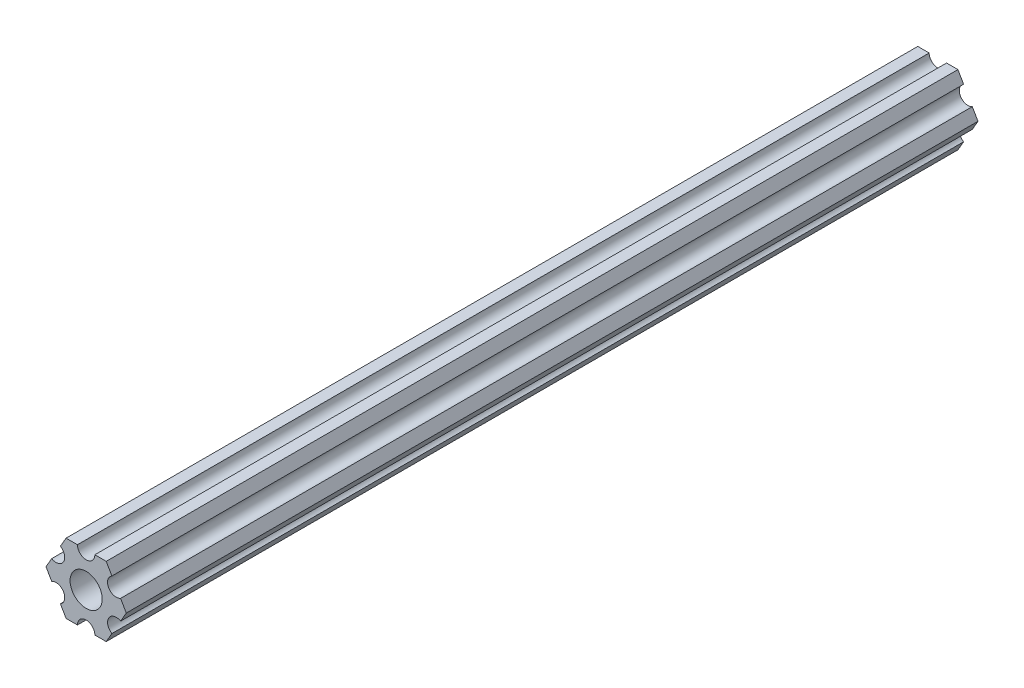
ISO-10303-21;
HEADER;
FILE_DESCRIPTION(('STEP AP214'),'2;1');
FILE_NAME('part.step','',(''),(''),'','','');
FILE_SCHEMA(('AUTOMOTIVE_DESIGN { 1 0 10303 214 1 1 1 1 }'));
ENDSEC;
DATA;
#1=APPLICATION_CONTEXT('core data for automotive mechanical design processes');
#2=APPLICATION_PROTOCOL_DEFINITION('international standard','automotive_design',2000,#1);
#3=PRODUCT_CONTEXT('',#1,'mechanical');
#4=PRODUCT('Part','Part','',(#3));
#5=PRODUCT_RELATED_PRODUCT_CATEGORY('part','',(#4));
#6=PRODUCT_DEFINITION_FORMATION('','',#4);
#7=PRODUCT_DEFINITION_CONTEXT('part definition',#1,'design');
#8=PRODUCT_DEFINITION('design','',#6,#7);
#9=PRODUCT_DEFINITION_SHAPE('','',#8);
#10=(LENGTH_UNIT() NAMED_UNIT(*) SI_UNIT(.MILLI.,.METRE.));
#11=(NAMED_UNIT(*) PLANE_ANGLE_UNIT() SI_UNIT($,.RADIAN.));
#12=(NAMED_UNIT(*) SI_UNIT($,.STERADIAN.) SOLID_ANGLE_UNIT());
#13=UNCERTAINTY_MEASURE_WITH_UNIT(LENGTH_MEASURE(1.E-05),#10,'distance_accuracy_value','');
#14=(GEOMETRIC_REPRESENTATION_CONTEXT(3) GLOBAL_UNCERTAINTY_ASSIGNED_CONTEXT((#13)) GLOBAL_UNIT_ASSIGNED_CONTEXT((#10,
#11,#12)) REPRESENTATION_CONTEXT('',''));
#15=CARTESIAN_POINT('',(0.,0.,0.));
#16=DIRECTION('',(0.,0.,1.));
#17=DIRECTION('',(1.,0.,0.));
#18=AXIS2_PLACEMENT_3D('',#15,#16,#17);
#19=CARTESIAN_POINT('',(5.49926169873049,-3.17500022210629,149.225));
#20=DIRECTION('',(0.,0.,1.));
#21=DIRECTION('',(1.,0.,0.));
#22=AXIS2_PLACEMENT_3D('',#19,#20,#21);
#23=CYLINDRICAL_SURFACE('',#22,1.5875);
#24=CARTESIAN_POINT('',(5.49926169873049,-3.17500022210629,304.8));
#25=DIRECTION('',(0.,0.,-1.));
#26=DIRECTION('',(-1.,0.,0.));
#27=AXIS2_PLACEMENT_3D('',#24,#25,#26);
#28=CIRCLE('',#27,1.5875);
#29=CARTESIAN_POINT('',(4.7055116987305,-4.5498155506141,304.8));
#30=VERTEX_POINT('',#29);
#31=CARTESIAN_POINT('',(6.29301169873047,-1.80018489359848,304.8));
#32=VERTEX_POINT('',#31);
#33=EDGE_CURVE('E189',#30,#32,#28,.T.);
#34=ORIENTED_EDGE('',*,*,#33,.F.);
#35=DIRECTION('',(0.,0.,1.));
#36=VECTOR('',#35,1.);
#37=CARTESIAN_POINT('',(4.7055116987305,-4.5498155506141,149.225));
#38=LINE('',#37,#36);
#39=CARTESIAN_POINT('',(4.7055116987305,-4.5498155506141,149.225));
#40=VERTEX_POINT('',#39);
#41=EDGE_CURVE('E11',#40,#30,#38,.T.);
#42=ORIENTED_EDGE('',*,*,#41,.F.);
#43=CARTESIAN_POINT('',(5.49926169873049,-3.17500022210629,149.225));
#44=DIRECTION('',(0.,0.,-1.));
#45=DIRECTION('',(-1.,0.,0.));
#46=AXIS2_PLACEMENT_3D('',#43,#44,#45);
#47=CIRCLE('',#46,1.5875);
#48=CARTESIAN_POINT('',(6.29301169873047,-1.80018489359848,149.225));
#49=VERTEX_POINT('',#48);
#50=EDGE_CURVE('E240',#40,#49,#47,.T.);
#51=ORIENTED_EDGE('',*,*,#50,.T.);
#52=DIRECTION('',(0.,0.,1.));
#53=VECTOR('',#52,1.);
#54=CARTESIAN_POINT('',(6.29301169873047,-1.80018489359848,149.225));
#55=LINE('',#54,#53);
#56=EDGE_CURVE('E35',#49,#32,#55,.T.);
#57=ORIENTED_EDGE('',*,*,#56,.T.);
#58=EDGE_LOOP('',(#34,#42,#51,#57));
#59=FACE_BOUND('',#58,.T.);
#60=ADVANCED_FACE('F32',(#59),#23,.F.);
#61=CARTESIAN_POINT('',(3.6661745940535,-6.35000022210627,149.225));
#62=DIRECTION('',(0.866025403784446,-0.499999999999988,0.));
#63=DIRECTION('',(0.499999999999988,0.866025403784446,0.));
#64=AXIS2_PLACEMENT_3D('',#61,#62,#63);
#65=PLANE('',#64);
#66=DIRECTION('',(0.499999999999988,0.866025403784446,0.));
#67=VECTOR('',#66,1.);
#68=CARTESIAN_POINT('',(3.6661745940535,-6.35000022210627,304.8));
#69=LINE('',#68,#67);
#70=CARTESIAN_POINT('',(3.6661745940535,-6.35000022210627,304.8));
#71=VERTEX_POINT('',#70);
#72=EDGE_CURVE('E238',#71,#30,#69,.T.);
#73=ORIENTED_EDGE('',*,*,#72,.F.);
#74=DIRECTION('',(0.,0.,1.));
#75=VECTOR('',#74,1.);
#76=CARTESIAN_POINT('',(3.6661745940535,-6.35000022210627,149.225));
#77=LINE('',#76,#75);
#78=CARTESIAN_POINT('',(3.6661745940535,-6.35000022210627,149.225));
#79=VERTEX_POINT('',#78);
#80=EDGE_CURVE('E41',#79,#71,#77,.T.);
#81=ORIENTED_EDGE('',*,*,#80,.F.);
#82=DIRECTION('',(0.499999999999988,0.866025403784446,0.));
#83=VECTOR('',#82,1.);
#84=CARTESIAN_POINT('',(3.6661745940535,-6.35000022210627,149.225));
#85=LINE('',#84,#83);
#86=EDGE_CURVE('E179',#79,#40,#85,.T.);
#87=ORIENTED_EDGE('',*,*,#86,.T.);
#88=ORIENTED_EDGE('',*,*,#41,.T.);
#89=EDGE_LOOP('',(#73,#81,#87,#88));
#90=FACE_BOUND('',#89,.T.);
#91=ADVANCED_FACE('F272',(#90),#65,.T.);
#92=CARTESIAN_POINT('',(1.58750038469929,-6.35000022210627,149.225));
#93=DIRECTION('',(0.,-1.,0.));
#94=DIRECTION('',(0.,0.,-1.));
#95=AXIS2_PLACEMENT_3D('',#92,#93,#94);
#96=PLANE('',#95);
#97=DIRECTION('',(1.,0.,0.));
#98=VECTOR('',#97,1.);
#99=CARTESIAN_POINT('',(1.58750038469929,-6.35000022210627,304.8));
#100=LINE('',#99,#98);
#101=CARTESIAN_POINT('',(1.58750038469929,-6.35000022210627,304.8));
#102=VERTEX_POINT('',#101);
#103=EDGE_CURVE('E166',#102,#71,#100,.T.);
#104=ORIENTED_EDGE('',*,*,#103,.F.);
#105=DIRECTION('',(0.,0.,1.));
#106=VECTOR('',#105,1.);
#107=CARTESIAN_POINT('',(1.58750038469929,-6.35000022210627,149.225));
#108=LINE('',#107,#106);
#109=CARTESIAN_POINT('',(1.58750038469929,-6.35000022210627,149.225));
#110=VERTEX_POINT('',#109);
#111=EDGE_CURVE('E161',#110,#102,#108,.T.);
#112=ORIENTED_EDGE('',*,*,#111,.F.);
#113=DIRECTION('',(1.,0.,0.));
#114=VECTOR('',#113,1.);
#115=CARTESIAN_POINT('',(1.58750038469929,-6.35000022210627,149.225));
#116=LINE('',#115,#114);
#117=EDGE_CURVE('E164',#110,#79,#116,.T.);
#118=ORIENTED_EDGE('',*,*,#117,.T.);
#119=ORIENTED_EDGE('',*,*,#80,.T.);
#120=EDGE_LOOP('',(#104,#112,#118,#119));
#121=FACE_BOUND('',#120,.T.);
#122=ADVANCED_FACE('F163',(#121),#96,.T.);
#123=CARTESIAN_POINT('',(3.84699290671026E-07,-6.35000022210627,149.225));
#124=DIRECTION('',(0.,0.,1.));
#125=DIRECTION('',(1.,0.,0.));
#126=AXIS2_PLACEMENT_3D('',#123,#124,#125);
#127=CYLINDRICAL_SURFACE('',#126,1.5875);
#128=CARTESIAN_POINT('',(3.84699290671026E-07,-6.35000022210627,304.8));
#129=DIRECTION('',(0.,0.,-1.));
#130=DIRECTION('',(-1.,0.,0.));
#131=AXIS2_PLACEMENT_3D('',#128,#129,#130);
#132=CIRCLE('',#131,1.5875);
#133=CARTESIAN_POINT('',(-1.58749961530071,-6.35000022210627,304.8));
#134=VERTEX_POINT('',#133);
#135=EDGE_CURVE('E235',#134,#102,#132,.T.);
#136=ORIENTED_EDGE('',*,*,#135,.F.);
#137=DIRECTION('',(0.,0.,1.));
#138=VECTOR('',#137,1.);
#139=CARTESIAN_POINT('',(-1.58749961530071,-6.35000022210627,149.225));
#140=LINE('',#139,#138);
#141=CARTESIAN_POINT('',(-1.58749961530071,-6.35000022210627,149.225));
#142=VERTEX_POINT('',#141);
#143=EDGE_CURVE('E171',#142,#134,#140,.T.);
#144=ORIENTED_EDGE('',*,*,#143,.F.);
#145=CARTESIAN_POINT('',(3.84699290671026E-07,-6.35000022210627,149.225));
#146=DIRECTION('',(0.,0.,-1.));
#147=DIRECTION('',(-1.,0.,0.));
#148=AXIS2_PLACEMENT_3D('',#145,#146,#147);
#149=CIRCLE('',#148,1.5875);
#150=EDGE_CURVE('E177',#142,#110,#149,.T.);
#151=ORIENTED_EDGE('',*,*,#150,.T.);
#152=ORIENTED_EDGE('',*,*,#111,.T.);
#153=EDGE_LOOP('',(#136,#144,#151,#152));
#154=FACE_BOUND('',#153,.T.);
#155=ADVANCED_FACE('F181',(#154),#127,.F.);
#156=CARTESIAN_POINT('',(-3.66617382465478,-6.35000022210627,149.225));
#157=DIRECTION('',(0.,-1.,0.));
#158=DIRECTION('',(1.,0.,0.));
#159=AXIS2_PLACEMENT_3D('',#156,#157,#158);
#160=PLANE('',#159);
#161=DIRECTION('',(1.,0.,0.));
#162=VECTOR('',#161,1.);
#163=CARTESIAN_POINT('',(-3.66617382465478,-6.35000022210627,304.8));
#164=LINE('',#163,#162);
#165=CARTESIAN_POINT('',(-3.66617382465478,-6.35000022210627,304.8));
#166=VERTEX_POINT('',#165);
#167=EDGE_CURVE('E232',#166,#134,#164,.T.);
#168=ORIENTED_EDGE('',*,*,#167,.F.);
#169=DIRECTION('',(0.,0.,1.));
#170=VECTOR('',#169,1.);
#171=CARTESIAN_POINT('',(-3.66617382465478,-6.35000022210627,149.225));
#172=LINE('',#171,#170);
#173=CARTESIAN_POINT('',(-3.66617382465478,-6.35000022210627,149.225));
#174=VERTEX_POINT('',#173);
#175=EDGE_CURVE('E244',#174,#166,#172,.T.);
#176=ORIENTED_EDGE('',*,*,#175,.F.);
#177=DIRECTION('',(1.,0.,0.));
#178=VECTOR('',#177,1.);
#179=CARTESIAN_POINT('',(-3.66617382465478,-6.35000022210627,149.225));
#180=LINE('',#179,#178);
#181=EDGE_CURVE('E182',#174,#142,#180,.T.);
#182=ORIENTED_EDGE('',*,*,#181,.T.);
#183=ORIENTED_EDGE('',*,*,#143,.T.);
#184=EDGE_LOOP('',(#168,#176,#182,#183));
#185=FACE_BOUND('',#184,.T.);
#186=ADVANCED_FACE('F285',(#185),#160,.T.);
#187=CARTESIAN_POINT('',(-4.70551103839171,-4.54981561357971,149.225));
#188=DIRECTION('',(-0.866025373493149,-0.500000052466048,0.));
#189=DIRECTION('',(0.500000052466048,-0.866025373493149,0.));
#190=AXIS2_PLACEMENT_3D('',#187,#188,#189);
#191=PLANE('',#190);
#192=DIRECTION('',(0.500000052466048,-0.866025373493149,0.));
#193=VECTOR('',#192,1.);
#194=CARTESIAN_POINT('',(-4.70551103839171,-4.54981561357971,304.8));
#195=LINE('',#194,#193);
#196=CARTESIAN_POINT('',(-4.70551103839171,-4.54981561357971,304.8));
#197=VERTEX_POINT('',#196);
#198=EDGE_CURVE('E229',#197,#166,#195,.T.);
#199=ORIENTED_EDGE('',*,*,#198,.F.);
#200=DIRECTION('',(0.,0.,1.));
#201=VECTOR('',#200,1.);
#202=CARTESIAN_POINT('',(-4.70551103839171,-4.54981561357971,149.225));
#203=LINE('',#202,#201);
#204=CARTESIAN_POINT('',(-4.70551103839171,-4.54981561357971,149.225));
#205=VERTEX_POINT('',#204);
#206=EDGE_CURVE('E246',#205,#197,#203,.T.);
#207=ORIENTED_EDGE('',*,*,#206,.F.);
#208=DIRECTION('',(0.500000052466048,-0.866025373493149,0.));
#209=VECTOR('',#208,1.);
#210=CARTESIAN_POINT('',(-4.70551103839171,-4.54981561357971,149.225));
#211=LINE('',#210,#209);
#212=EDGE_CURVE('E184',#205,#174,#211,.T.);
#213=ORIENTED_EDGE('',*,*,#212,.T.);
#214=ORIENTED_EDGE('',*,*,#175,.T.);
#215=EDGE_LOOP('',(#199,#207,#213,#214));
#216=FACE_BOUND('',#215,.T.);
#217=ADVANCED_FACE('F288',(#216),#191,.T.);
#218=CARTESIAN_POINT('',(-5.49926112168156,-3.17500033315934,149.225));
#219=DIRECTION('',(0.,0.,1.));
#220=DIRECTION('',(1.,0.,0.));
#221=AXIS2_PLACEMENT_3D('',#218,#219,#220);
#222=CYLINDRICAL_SURFACE('',#221,1.5875);
#223=CARTESIAN_POINT('',(-5.49926112168156,-3.17500033315934,304.8));
#224=DIRECTION('',(0.,0.,-1.));
#225=DIRECTION('',(-1.,0.,0.));
#226=AXIS2_PLACEMENT_3D('',#223,#224,#225);
#227=CIRCLE('',#226,1.5875);
#228=CARTESIAN_POINT('',(-6.29301120497141,-1.80018505273897,304.8));
#229=VERTEX_POINT('',#228);
#230=EDGE_CURVE('E226',#229,#197,#227,.T.);
#231=ORIENTED_EDGE('',*,*,#230,.F.);
#232=DIRECTION('',(0.,0.,1.));
#233=VECTOR('',#232,1.);
#234=CARTESIAN_POINT('',(-6.29301120497141,-1.80018505273897,149.225));
#235=LINE('',#234,#233);
#236=CARTESIAN_POINT('',(-6.29301120497141,-1.80018505273897,149.225));
#237=VERTEX_POINT('',#236);
#238=EDGE_CURVE('E248',#237,#229,#235,.T.);
#239=ORIENTED_EDGE('',*,*,#238,.F.);
#240=CARTESIAN_POINT('',(-5.49926112168156,-3.17500033315934,149.225));
#241=DIRECTION('',(0.,0.,-1.));
#242=DIRECTION('',(-1.,0.,0.));
#243=AXIS2_PLACEMENT_3D('',#240,#241,#242);
#244=CIRCLE('',#243,1.5875);
#245=EDGE_CURVE('E393',#237,#205,#244,.T.);
#246=ORIENTED_EDGE('',*,*,#245,.T.);
#247=ORIENTED_EDGE('',*,*,#206,.T.);
#248=EDGE_LOOP('',(#231,#239,#246,#247));
#249=FACE_BOUND('',#248,.T.);
#250=ADVANCED_FACE('F292',(#249),#222,.F.);
#251=CARTESIAN_POINT('',(-7.33234841870827,-4.44212523790841E-07,149.225));
#252=DIRECTION('',(-0.86602537349315,-0.500000052466048,0.));
#253=DIRECTION('',(0.500000052466048,-0.86602537349315,0.));
#254=AXIS2_PLACEMENT_3D('',#251,#252,#253);
#255=PLANE('',#254);
#256=DIRECTION('',(0.500000052466048,-0.86602537349315,0.));
#257=VECTOR('',#256,1.);
#258=CARTESIAN_POINT('',(-7.33234841870827,-4.44212523790841E-07,304.8));
#259=LINE('',#258,#257);
#260=CARTESIAN_POINT('',(-7.33234841870827,-4.44212523790841E-07,304.8));
#261=VERTEX_POINT('',#260);
#262=EDGE_CURVE('E223',#261,#229,#259,.T.);
#263=ORIENTED_EDGE('',*,*,#262,.F.);
#264=DIRECTION('',(0.,0.,1.));
#265=VECTOR('',#264,1.);
#266=CARTESIAN_POINT('',(-7.33234841870827,-4.44212523790841E-07,149.225));
#267=LINE('',#266,#265);
#268=CARTESIAN_POINT('',(-7.33234841870827,-4.44212523790841E-07,149.225));
#269=VERTEX_POINT('',#268);
#270=EDGE_CURVE('E250',#269,#261,#267,.T.);
#271=ORIENTED_EDGE('',*,*,#270,.F.);
#272=DIRECTION('',(0.500000052466048,-0.86602537349315,0.));
#273=VECTOR('',#272,1.);
#274=CARTESIAN_POINT('',(-7.33234841870827,-4.44212523790841E-07,149.225));
#275=LINE('',#274,#273);
#276=EDGE_CURVE('E390',#269,#237,#275,.T.);
#277=ORIENTED_EDGE('',*,*,#276,.T.);
#278=ORIENTED_EDGE('',*,*,#238,.T.);
#279=EDGE_LOOP('',(#263,#271,#277,#278));
#280=FACE_BOUND('',#279,.T.);
#281=ADVANCED_FACE('F296',(#280),#255,.T.);
#282=CARTESIAN_POINT('',(-6.29301142309098,1.80018429024547,149.225));
#283=DIRECTION('',(-0.866025434075722,0.499999947533955,0.));
#284=DIRECTION('',(-0.499999947533955,-0.866025434075722,0.));
#285=AXIS2_PLACEMENT_3D('',#282,#283,#284);
#286=PLANE('',#285);
#287=DIRECTION('',(-0.499999947533955,-0.866025434075722,0.));
#288=VECTOR('',#287,1.);
#289=CARTESIAN_POINT('',(-6.29301142309098,1.80018429024547,304.8));
#290=LINE('',#289,#288);
#291=CARTESIAN_POINT('',(-6.29301142309098,1.80018429024546,304.8));
#292=VERTEX_POINT('',#291);
#293=EDGE_CURVE('E220',#292,#261,#290,.T.);
#294=ORIENTED_EDGE('',*,*,#293,.F.);
#295=DIRECTION('',(0.,0.,1.));
#296=VECTOR('',#295,1.);
#297=CARTESIAN_POINT('',(-6.29301142309098,1.80018429024546,149.225));
#298=LINE('',#297,#296);
#299=CARTESIAN_POINT('',(-6.29301142309098,1.80018429024546,149.225));
#300=VERTEX_POINT('',#299);
#301=EDGE_CURVE('E252',#300,#292,#298,.T.);
#302=ORIENTED_EDGE('',*,*,#301,.F.);
#303=DIRECTION('',(-0.499999947533955,-0.866025434075722,0.));
#304=VECTOR('',#303,1.);
#305=CARTESIAN_POINT('',(-6.29301142309098,1.80018429024547,149.225));
#306=LINE('',#305,#304);
#307=EDGE_CURVE('E387',#300,#269,#306,.T.);
#308=ORIENTED_EDGE('',*,*,#307,.T.);
#309=ORIENTED_EDGE('',*,*,#270,.T.);
#310=EDGE_LOOP('',(#294,#302,#308,#309));
#311=FACE_BOUND('',#310,.T.);
#312=ADVANCED_FACE('F300',(#311),#286,.T.);
#313=CARTESIAN_POINT('',(-5.49926150638083,3.17499966684067,149.225));
#314=DIRECTION('',(0.,0.,1.));
#315=DIRECTION('',(1.,0.,0.));
#316=AXIS2_PLACEMENT_3D('',#313,#314,#315);
#317=CYLINDRICAL_SURFACE('',#316,1.5875);
#318=CARTESIAN_POINT('',(-5.49926150638083,3.17499966684067,304.8));
#319=DIRECTION('',(0.,0.,-1.));
#320=DIRECTION('',(-1.,0.,0.));
#321=AXIS2_PLACEMENT_3D('',#318,#319,#320);
#322=CIRCLE('',#321,1.5875);
#323=CARTESIAN_POINT('',(-4.70551158967067,4.54981504343588,304.8));
#324=VERTEX_POINT('',#323);
#325=EDGE_CURVE('E217',#324,#292,#322,.T.);
#326=ORIENTED_EDGE('',*,*,#325,.F.);
#327=DIRECTION('',(0.,0.,1.));
#328=VECTOR('',#327,1.);
#329=CARTESIAN_POINT('',(-4.70551158967067,4.54981504343588,149.225));
#330=LINE('',#329,#328);
#331=CARTESIAN_POINT('',(-4.70551158967067,4.54981504343588,149.225));
#332=VERTEX_POINT('',#331);
#333=EDGE_CURVE('E254',#332,#324,#330,.T.);
#334=ORIENTED_EDGE('',*,*,#333,.F.);
#335=CARTESIAN_POINT('',(-5.49926150638083,3.17499966684067,149.225));
#336=DIRECTION('',(0.,0.,-1.));
#337=DIRECTION('',(-1.,0.,0.));
#338=AXIS2_PLACEMENT_3D('',#335,#336,#337);
#339=CIRCLE('',#338,1.5875);
#340=EDGE_CURVE('E384',#332,#300,#339,.T.);
#341=ORIENTED_EDGE('',*,*,#340,.T.);
#342=ORIENTED_EDGE('',*,*,#301,.T.);
#343=EDGE_LOOP('',(#326,#334,#341,#342));
#344=FACE_BOUND('',#343,.T.);
#345=ADVANCED_FACE('F304',(#344),#317,.F.);
#346=CARTESIAN_POINT('',(-3.66617459405348,6.3499997778937,149.225));
#347=DIRECTION('',(-0.866025434075722,0.499999947533955,0.));
#348=DIRECTION('',(-0.499999947533955,-0.866025434075722,0.));
#349=AXIS2_PLACEMENT_3D('',#346,#347,#348);
#350=PLANE('',#349);
#351=DIRECTION('',(-0.499999947533955,-0.866025434075722,0.));
#352=VECTOR('',#351,1.);
#353=CARTESIAN_POINT('',(-3.66617459405348,6.3499997778937,304.8));
#354=LINE('',#353,#352);
#355=CARTESIAN_POINT('',(-3.66617459405348,6.3499997778937,304.8));
#356=VERTEX_POINT('',#355);
#357=EDGE_CURVE('E214',#356,#324,#354,.T.);
#358=ORIENTED_EDGE('',*,*,#357,.F.);
#359=DIRECTION('',(0.,0.,1.));
#360=VECTOR('',#359,1.);
#361=CARTESIAN_POINT('',(-3.66617459405348,6.3499997778937,149.225));
#362=LINE('',#361,#360);
#363=CARTESIAN_POINT('',(-3.66617459405348,6.3499997778937,149.225));
#364=VERTEX_POINT('',#363);
#365=EDGE_CURVE('E256',#364,#356,#362,.T.);
#366=ORIENTED_EDGE('',*,*,#365,.F.);
#367=DIRECTION('',(-0.499999947533955,-0.866025434075722,0.));
#368=VECTOR('',#367,1.);
#369=CARTESIAN_POINT('',(-3.66617459405348,6.3499997778937,149.225));
#370=LINE('',#369,#368);
#371=EDGE_CURVE('E381',#364,#332,#370,.T.);
#372=ORIENTED_EDGE('',*,*,#371,.T.);
#373=ORIENTED_EDGE('',*,*,#333,.T.);
#374=EDGE_LOOP('',(#358,#366,#372,#373));
#375=FACE_BOUND('',#374,.T.);
#376=ADVANCED_FACE('F308',(#375),#350,.T.);
#377=CARTESIAN_POINT('',(-1.58750038469926,6.3499997778937,149.225));
#378=DIRECTION('',(0.,1.,0.));
#379=DIRECTION('',(0.,0.,1.));
#380=AXIS2_PLACEMENT_3D('',#377,#378,#379);
#381=PLANE('',#380);
#382=DIRECTION('',(-1.,0.,0.));
#383=VECTOR('',#382,1.);
#384=CARTESIAN_POINT('',(-1.58750038469926,6.3499997778937,304.8));
#385=LINE('',#384,#383);
#386=CARTESIAN_POINT('',(-1.58750038469926,6.3499997778937,304.8));
#387=VERTEX_POINT('',#386);
#388=EDGE_CURVE('E211',#387,#356,#385,.T.);
#389=ORIENTED_EDGE('',*,*,#388,.F.);
#390=DIRECTION('',(0.,0.,1.));
#391=VECTOR('',#390,1.);
#392=CARTESIAN_POINT('',(-1.58750038469926,6.3499997778937,149.225));
#393=LINE('',#392,#391);
#394=CARTESIAN_POINT('',(-1.58750038469926,6.3499997778937,149.225));
#395=VERTEX_POINT('',#394);
#396=EDGE_CURVE('E258',#395,#387,#393,.T.);
#397=ORIENTED_EDGE('',*,*,#396,.F.);
#398=DIRECTION('',(-1.,0.,0.));
#399=VECTOR('',#398,1.);
#400=CARTESIAN_POINT('',(-1.58750038469926,6.3499997778937,149.225));
#401=LINE('',#400,#399);
#402=EDGE_CURVE('E378',#395,#364,#401,.T.);
#403=ORIENTED_EDGE('',*,*,#402,.T.);
#404=ORIENTED_EDGE('',*,*,#365,.T.);
#405=EDGE_LOOP('',(#389,#397,#403,#404));
#406=FACE_BOUND('',#405,.T.);
#407=ADVANCED_FACE('F312',(#406),#381,.T.);
#408=CARTESIAN_POINT('',(-3.84699252021695E-07,6.3499997778937,149.225));
#409=DIRECTION('',(0.,0.,1.));
#410=DIRECTION('',(1.,0.,0.));
#411=AXIS2_PLACEMENT_3D('',#408,#409,#410);
#412=CYLINDRICAL_SURFACE('',#411,1.5875);
#413=CARTESIAN_POINT('',(-3.84699252021695E-07,6.3499997778937,304.8));
#414=DIRECTION('',(0.,0.,-1.));
#415=DIRECTION('',(-1.,0.,0.));
#416=AXIS2_PLACEMENT_3D('',#413,#414,#415);
#417=CIRCLE('',#416,1.5875);
#418=CARTESIAN_POINT('',(1.58749961530075,6.3499997778937,304.8));
#419=VERTEX_POINT('',#418);
#420=EDGE_CURVE('E208',#419,#387,#417,.T.);
#421=ORIENTED_EDGE('',*,*,#420,.F.);
#422=DIRECTION('',(0.,0.,1.));
#423=VECTOR('',#422,1.);
#424=CARTESIAN_POINT('',(1.58749961530075,6.3499997778937,149.225));
#425=LINE('',#424,#423);
#426=CARTESIAN_POINT('',(1.58749961530075,6.3499997778937,149.225));
#427=VERTEX_POINT('',#426);
#428=EDGE_CURVE('E260',#427,#419,#425,.T.);
#429=ORIENTED_EDGE('',*,*,#428,.F.);
#430=CARTESIAN_POINT('',(-3.84699252021695E-07,6.3499997778937,149.225));
#431=DIRECTION('',(0.,0.,-1.));
#432=DIRECTION('',(-1.,0.,0.));
#433=AXIS2_PLACEMENT_3D('',#430,#431,#432);
#434=CIRCLE('',#433,1.5875);
#435=EDGE_CURVE('E375',#427,#395,#434,.T.);
#436=ORIENTED_EDGE('',*,*,#435,.T.);
#437=ORIENTED_EDGE('',*,*,#396,.T.);
#438=EDGE_LOOP('',(#421,#429,#436,#437));
#439=FACE_BOUND('',#438,.T.);
#440=ADVANCED_FACE('F316',(#439),#412,.F.);
#441=CARTESIAN_POINT('',(3.66617382465482,6.3499997778937,149.225));
#442=DIRECTION('',(0.,1.,0.));
#443=DIRECTION('',(0.,0.,1.));
#444=AXIS2_PLACEMENT_3D('',#441,#442,#443);
#445=PLANE('',#444);
#446=DIRECTION('',(-1.,0.,0.));
#447=VECTOR('',#446,1.);
#448=CARTESIAN_POINT('',(3.66617382465482,6.3499997778937,304.8));
#449=LINE('',#448,#447);
#450=CARTESIAN_POINT('',(3.66617382465482,6.3499997778937,304.8));
#451=VERTEX_POINT('',#450);
#452=EDGE_CURVE('E205',#451,#419,#449,.T.);
#453=ORIENTED_EDGE('',*,*,#452,.F.);
#454=DIRECTION('',(0.,0.,1.));
#455=VECTOR('',#454,1.);
#456=CARTESIAN_POINT('',(3.66617382465482,6.3499997778937,149.225));
#457=LINE('',#456,#455);
#458=CARTESIAN_POINT('',(3.66617382465482,6.3499997778937,149.225));
#459=VERTEX_POINT('',#458);
#460=EDGE_CURVE('E262',#459,#451,#457,.T.);
#461=ORIENTED_EDGE('',*,*,#460,.F.);
#462=DIRECTION('',(-1.,0.,0.));
#463=VECTOR('',#462,1.);
#464=CARTESIAN_POINT('',(3.66617382465482,6.3499997778937,149.225));
#465=LINE('',#464,#463);
#466=EDGE_CURVE('E372',#459,#427,#465,.T.);
#467=ORIENTED_EDGE('',*,*,#466,.T.);
#468=ORIENTED_EDGE('',*,*,#428,.T.);
#469=EDGE_LOOP('',(#453,#461,#467,#468));
#470=FACE_BOUND('',#469,.T.);
#471=ADVANCED_FACE('F320',(#470),#445,.T.);
#472=CARTESIAN_POINT('',(4.70551118909645,4.54981503427037,149.225));
#473=DIRECTION('',(0.866025358347508,0.500000078699064,0.));
#474=DIRECTION('',(-0.500000078699064,0.866025358347508,0.));
#475=AXIS2_PLACEMENT_3D('',#472,#473,#474);
#476=PLANE('',#475);
#477=DIRECTION('',(-0.500000078699064,0.866025358347508,0.));
#478=VECTOR('',#477,1.);
#479=CARTESIAN_POINT('',(4.70551118909645,4.54981503427037,304.8));
#480=LINE('',#479,#478);
#481=CARTESIAN_POINT('',(4.70551118909645,4.54981503427037,304.8));
#482=VERTEX_POINT('',#481);
#483=EDGE_CURVE('E202',#482,#451,#480,.T.);
#484=ORIENTED_EDGE('',*,*,#483,.F.);
#485=DIRECTION('',(0.,0.,1.));
#486=VECTOR('',#485,1.);
#487=CARTESIAN_POINT('',(4.70551118909645,4.54981503427037,149.225));
#488=LINE('',#487,#486);
#489=CARTESIAN_POINT('',(4.70551118909645,4.54981503427037,149.225));
#490=VERTEX_POINT('',#489);
#491=EDGE_CURVE('E264',#490,#482,#488,.T.);
#492=ORIENTED_EDGE('',*,*,#491,.F.);
#493=DIRECTION('',(-0.500000078699064,0.866025358347508,0.));
#494=VECTOR('',#493,1.);
#495=CARTESIAN_POINT('',(4.70551118909645,4.54981503427037,149.225));
#496=LINE('',#495,#494);
#497=EDGE_CURVE('E369',#490,#459,#496,.T.);
#498=ORIENTED_EDGE('',*,*,#497,.T.);
#499=ORIENTED_EDGE('',*,*,#460,.T.);
#500=EDGE_LOOP('',(#484,#492,#498,#499));
#501=FACE_BOUND('',#500,.T.);
#502=ADVANCED_FACE('F324',(#501),#476,.T.);
#503=CARTESIAN_POINT('',(5.49926131403121,3.1749997778937,149.225));
#504=DIRECTION('',(0.,0.,1.));
#505=DIRECTION('',(1.,0.,0.));
#506=AXIS2_PLACEMENT_3D('',#503,#504,#505);
#507=CYLINDRICAL_SURFACE('',#506,1.5875);
#508=CARTESIAN_POINT('',(5.49926131403121,3.1749997778937,304.8));
#509=DIRECTION('',(0.,0.,-1.));
#510=DIRECTION('',(-1.,0.,0.));
#511=AXIS2_PLACEMENT_3D('',#508,#509,#510);
#512=CIRCLE('',#511,1.5875);
#513=CARTESIAN_POINT('',(6.29301143896598,1.80018452151703,304.8));
#514=VERTEX_POINT('',#513);
#515=EDGE_CURVE('E199',#514,#482,#512,.T.);
#516=ORIENTED_EDGE('',*,*,#515,.F.);
#517=DIRECTION('',(0.,0.,1.));
#518=VECTOR('',#517,1.);
#519=CARTESIAN_POINT('',(6.29301143896598,1.80018452151703,149.225));
#520=LINE('',#519,#518);
#521=CARTESIAN_POINT('',(6.29301143896598,1.80018452151703,149.225));
#522=VERTEX_POINT('',#521);
#523=EDGE_CURVE('E266',#522,#514,#520,.T.);
#524=ORIENTED_EDGE('',*,*,#523,.F.);
#525=CARTESIAN_POINT('',(5.49926131403121,3.1749997778937,149.225));
#526=DIRECTION('',(0.,0.,-1.));
#527=DIRECTION('',(-1.,0.,0.));
#528=AXIS2_PLACEMENT_3D('',#525,#526,#527);
#529=CIRCLE('',#528,1.5875);
#530=EDGE_CURVE('E366',#522,#490,#529,.T.);
#531=ORIENTED_EDGE('',*,*,#530,.T.);
#532=ORIENTED_EDGE('',*,*,#491,.T.);
#533=EDGE_LOOP('',(#516,#524,#531,#532));
#534=FACE_BOUND('',#533,.T.);
#535=ADVANCED_FACE('F328',(#534),#507,.F.);
#536=CARTESIAN_POINT('',(7.33234880340755,-2.22106190273918E-07,149.225));
#537=DIRECTION('',(0.866025358347509,0.500000078699063,0.));
#538=DIRECTION('',(-0.500000078699063,0.866025358347509,0.));
#539=AXIS2_PLACEMENT_3D('',#536,#537,#538);
#540=PLANE('',#539);
#541=DIRECTION('',(-0.500000078699063,0.866025358347509,0.));
#542=VECTOR('',#541,1.);
#543=CARTESIAN_POINT('',(7.33234880340755,-2.22106190273918E-07,304.8));
#544=LINE('',#543,#542);
#545=CARTESIAN_POINT('',(7.33234880340755,-2.22106190273918E-07,304.8));
#546=VERTEX_POINT('',#545);
#547=EDGE_CURVE('E196',#546,#514,#544,.T.);
#548=ORIENTED_EDGE('',*,*,#547,.F.);
#549=DIRECTION('',(0.,0.,1.));
#550=VECTOR('',#549,1.);
#551=CARTESIAN_POINT('',(7.33234880340755,-2.22106190273918E-07,149.225));
#552=LINE('',#551,#550);
#553=CARTESIAN_POINT('',(7.33234880340755,-2.22106190273918E-07,149.225));
#554=VERTEX_POINT('',#553);
#555=EDGE_CURVE('E267',#554,#546,#552,.T.);
#556=ORIENTED_EDGE('',*,*,#555,.F.);
#557=DIRECTION('',(-0.500000078699063,0.866025358347509,0.));
#558=VECTOR('',#557,1.);
#559=CARTESIAN_POINT('',(7.33234880340755,-2.22106190273918E-07,149.225));
#560=LINE('',#559,#558);
#561=EDGE_CURVE('E363',#554,#522,#560,.T.);
#562=ORIENTED_EDGE('',*,*,#561,.T.);
#563=ORIENTED_EDGE('',*,*,#523,.T.);
#564=EDGE_LOOP('',(#548,#556,#562,#563));
#565=FACE_BOUND('',#564,.T.);
#566=ADVANCED_FACE('F332',(#565),#540,.T.);
#567=CARTESIAN_POINT('',(6.29301169873047,-1.80018489359848,149.225));
#568=DIRECTION('',(0.866025403784445,-0.499999999999988,0.));
#569=DIRECTION('',(0.499999999999988,0.866025403784445,0.));
#570=AXIS2_PLACEMENT_3D('',#567,#568,#569);
#571=PLANE('',#570);
#572=DIRECTION('',(0.499999999999988,0.866025403784446,0.));
#573=VECTOR('',#572,1.);
#574=CARTESIAN_POINT('',(6.29301169873047,-1.80018489359848,304.8));
#575=LINE('',#574,#573);
#576=EDGE_CURVE('E192',#32,#546,#575,.T.);
#577=ORIENTED_EDGE('',*,*,#576,.F.);
#578=ORIENTED_EDGE('',*,*,#56,.F.);
#579=DIRECTION('',(0.499999999999988,0.866025403784446,0.));
#580=VECTOR('',#579,1.);
#581=CARTESIAN_POINT('',(6.29301169873047,-1.80018489359848,149.225));
#582=LINE('',#581,#580);
#583=EDGE_CURVE('E361',#49,#554,#582,.T.);
#584=ORIENTED_EDGE('',*,*,#583,.T.);
#585=ORIENTED_EDGE('',*,*,#555,.T.);
#586=EDGE_LOOP('',(#577,#578,#584,#585));
#587=FACE_BOUND('',#586,.T.);
#588=ADVANCED_FACE('F269',(#587),#571,.T.);
#589=CARTESIAN_POINT('',(5.49926169873049,-3.17500022210629,149.225));
#590=DIRECTION('',(0.,0.,-1.));
#591=DIRECTION('',(-1.,0.,0.));
#592=AXIS2_PLACEMENT_3D('',#589,#590,#591);
#593=PLANE('',#592);
#594=CARTESIAN_POINT('',(0.,0.,149.225));
#595=DIRECTION('',(0.,0.,1.));
#596=DIRECTION('',(-1.,0.,0.));
#597=AXIS2_PLACEMENT_3D('',#594,#595,#596);
#598=CIRCLE('',#597,2.9337);
#599=CARTESIAN_POINT('',(-2.9337,0.,149.225));
#600=VERTEX_POINT('',#599);
#601=EDGE_CURVE('E193',#600,#600,#598,.T.);
#602=ORIENTED_EDGE('',*,*,#601,.T.);
#603=EDGE_LOOP('',(#602));
#604=FACE_BOUND('',#603,.T.);
#605=ORIENTED_EDGE('',*,*,#50,.F.);
#606=ORIENTED_EDGE('',*,*,#86,.F.);
#607=ORIENTED_EDGE('',*,*,#117,.F.);
#608=ORIENTED_EDGE('',*,*,#150,.F.);
#609=ORIENTED_EDGE('',*,*,#181,.F.);
#610=ORIENTED_EDGE('',*,*,#212,.F.);
#611=ORIENTED_EDGE('',*,*,#245,.F.);
#612=ORIENTED_EDGE('',*,*,#276,.F.);
#613=ORIENTED_EDGE('',*,*,#307,.F.);
#614=ORIENTED_EDGE('',*,*,#340,.F.);
#615=ORIENTED_EDGE('',*,*,#371,.F.);
#616=ORIENTED_EDGE('',*,*,#402,.F.);
#617=ORIENTED_EDGE('',*,*,#435,.F.);
#618=ORIENTED_EDGE('',*,*,#466,.F.);
#619=ORIENTED_EDGE('',*,*,#497,.F.);
#620=ORIENTED_EDGE('',*,*,#530,.F.);
#621=ORIENTED_EDGE('',*,*,#561,.F.);
#622=ORIENTED_EDGE('',*,*,#583,.F.);
#623=EDGE_LOOP('',(#605,#606,#607,#608,#609,#610,#611,#612,#613,#614,#615,#616,#617,#618,#619,
#620,#621,#622));
#624=FACE_BOUND('',#623,.T.);
#625=ADVANCED_FACE('F175',(#604,#624),#593,.T.);
#626=CARTESIAN_POINT('',(5.49926169873049,-3.17500022210629,304.8));
#627=DIRECTION('',(0.,0.,-1.));
#628=DIRECTION('',(-1.,0.,0.));
#629=AXIS2_PLACEMENT_3D('',#626,#627,#628);
#630=PLANE('',#629);
#631=CARTESIAN_POINT('',(0.,0.,304.8));
#632=DIRECTION('',(0.,0.,1.));
#633=DIRECTION('',(-1.,0.,0.));
#634=AXIS2_PLACEMENT_3D('',#631,#632,#633);
#635=CIRCLE('',#634,2.9337);
#636=CARTESIAN_POINT('',(-2.9337,0.,304.8));
#637=VERTEX_POINT('',#636);
#638=EDGE_CURVE('E356',#637,#637,#635,.T.);
#639=ORIENTED_EDGE('',*,*,#638,.F.);
#640=EDGE_LOOP('',(#639));
#641=FACE_BOUND('',#640,.T.);
#642=ORIENTED_EDGE('',*,*,#33,.T.);
#643=ORIENTED_EDGE('',*,*,#576,.T.);
#644=ORIENTED_EDGE('',*,*,#547,.T.);
#645=ORIENTED_EDGE('',*,*,#515,.T.);
#646=ORIENTED_EDGE('',*,*,#483,.T.);
#647=ORIENTED_EDGE('',*,*,#452,.T.);
#648=ORIENTED_EDGE('',*,*,#420,.T.);
#649=ORIENTED_EDGE('',*,*,#388,.T.);
#650=ORIENTED_EDGE('',*,*,#357,.T.);
#651=ORIENTED_EDGE('',*,*,#325,.T.);
#652=ORIENTED_EDGE('',*,*,#293,.T.);
#653=ORIENTED_EDGE('',*,*,#262,.T.);
#654=ORIENTED_EDGE('',*,*,#230,.T.);
#655=ORIENTED_EDGE('',*,*,#198,.T.);
#656=ORIENTED_EDGE('',*,*,#167,.T.);
#657=ORIENTED_EDGE('',*,*,#135,.T.);
#658=ORIENTED_EDGE('',*,*,#103,.T.);
#659=ORIENTED_EDGE('',*,*,#72,.T.);
#660=EDGE_LOOP('',(#642,#643,#644,#645,#646,#647,#648,#649,#650,#651,#652,#653,#654,#655,#656,
#657,#658,#659));
#661=FACE_BOUND('',#660,.T.);
#662=ADVANCED_FACE('F271',(#641,#661),#630,.F.);
#663=CARTESIAN_POINT('',(0.,0.,149.225));
#664=DIRECTION('',(0.,0.,1.));
#665=DIRECTION('',(1.,0.,0.));
#666=AXIS2_PLACEMENT_3D('',#663,#664,#665);
#667=CYLINDRICAL_SURFACE('',#666,2.9337);
#668=ORIENTED_EDGE('',*,*,#601,.F.);
#669=EDGE_LOOP('',(#668));
#670=FACE_BOUND('',#669,.T.);
#671=ORIENTED_EDGE('',*,*,#638,.T.);
#672=EDGE_LOOP('',(#671));
#673=FACE_BOUND('',#672,.T.);
#674=ADVANCED_FACE('F344',(#670,#673),#667,.F.);
#675=CLOSED_SHELL('',(#60,#91,#122,#155,#186,#217,#250,#281,#312,#345,#376,#407,#440,#471,#502,
#535,#566,#588,#625,#662,#674));
#676=MANIFOLD_SOLID_BREP('B2',#675);
#677=ADVANCED_BREP_SHAPE_REPRESENTATION('',(#18,#676),#14);
#678=SHAPE_DEFINITION_REPRESENTATION(#9,#677);
ENDSEC;
END-ISO-10303-21;
